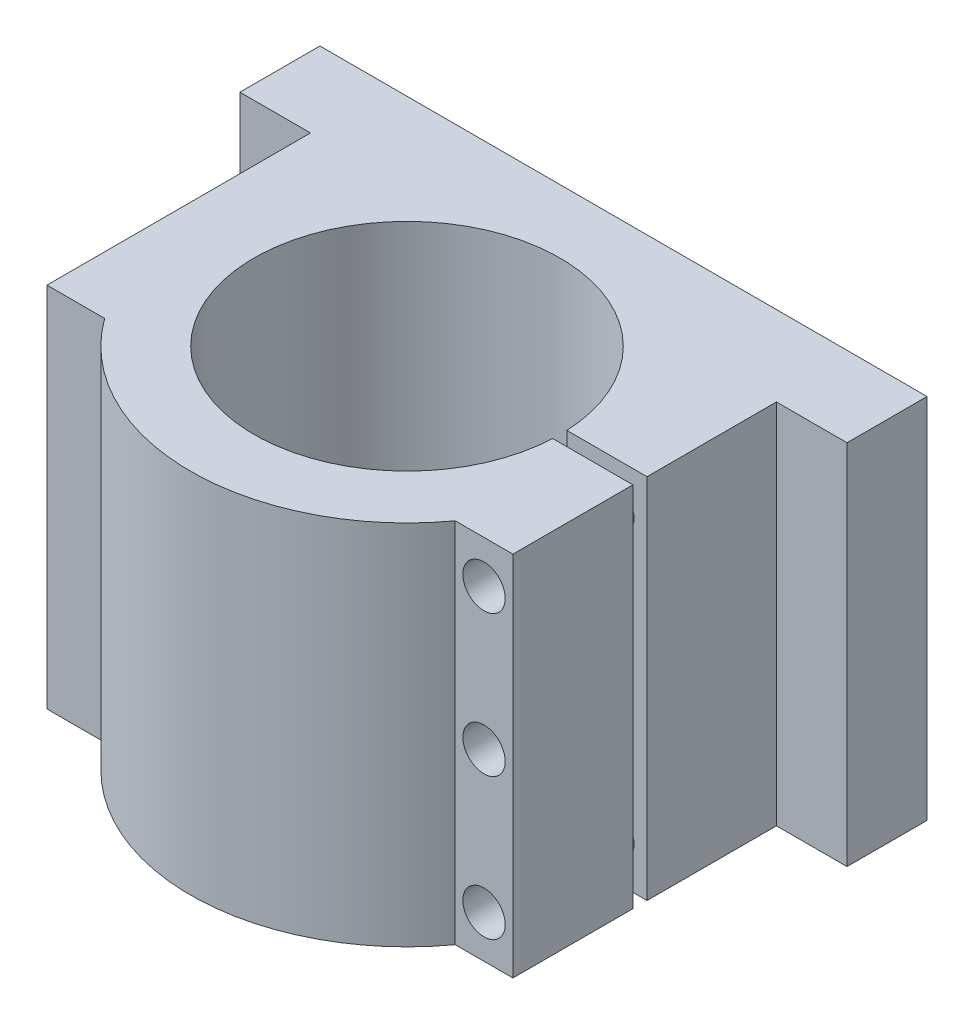
ISO-10303-21;
HEADER;
FILE_DESCRIPTION(('STEP AP214'),'2;1');
FILE_NAME('part.step','',(''),(''),'','','');
FILE_SCHEMA(('AUTOMOTIVE_DESIGN { 1 0 10303 214 1 1 1 1 }'));
ENDSEC;
DATA;
#1=APPLICATION_CONTEXT('core data for automotive mechanical design processes');
#2=APPLICATION_PROTOCOL_DEFINITION('international standard','automotive_design',2000,#1);
#3=PRODUCT_CONTEXT('',#1,'mechanical');
#4=PRODUCT('Part','Part','',(#3));
#5=PRODUCT_RELATED_PRODUCT_CATEGORY('part','',(#4));
#6=PRODUCT_DEFINITION_FORMATION('','',#4);
#7=PRODUCT_DEFINITION_CONTEXT('part definition',#1,'design');
#8=PRODUCT_DEFINITION('design','',#6,#7);
#9=PRODUCT_DEFINITION_SHAPE('','',#8);
#10=(LENGTH_UNIT() NAMED_UNIT(*) SI_UNIT(.MILLI.,.METRE.));
#11=(NAMED_UNIT(*) PLANE_ANGLE_UNIT() SI_UNIT($,.RADIAN.));
#12=(NAMED_UNIT(*) SI_UNIT($,.STERADIAN.) SOLID_ANGLE_UNIT());
#13=UNCERTAINTY_MEASURE_WITH_UNIT(LENGTH_MEASURE(1.E-05),#10,'distance_accuracy_value','');
#14=(GEOMETRIC_REPRESENTATION_CONTEXT(3) GLOBAL_UNCERTAINTY_ASSIGNED_CONTEXT((#13)) GLOBAL_UNIT_ASSIGNED_CONTEXT((#10,
#11,#12)) REPRESENTATION_CONTEXT('',''));
#15=CARTESIAN_POINT('',(0.,0.,0.));
#16=DIRECTION('',(0.,0.,1.));
#17=DIRECTION('',(1.,0.,0.));
#18=AXIS2_PLACEMENT_3D('',#15,#16,#17);
#19=CARTESIAN_POINT('',(37.2424488990722,78.,73.));
#20=DIRECTION('',(0.,0.,-1.));
#21=DIRECTION('',(-1.,0.,0.));
#22=AXIS2_PLACEMENT_3D('',#19,#20,#21);
#23=PLANE('',#22);
#24=DIRECTION('',(1.,0.,0.));
#25=VECTOR('',#24,1.);
#26=CARTESIAN_POINT('',(37.2424488990722,0.,73.));
#27=LINE('',#26,#25);
#28=CARTESIAN_POINT('',(37.2424488990722,0.,73.));
#29=VERTEX_POINT('',#28);
#30=CARTESIAN_POINT('',(49.5,0.,73.));
#31=VERTEX_POINT('',#30);
#32=EDGE_CURVE('E192',#29,#31,#27,.T.);
#33=ORIENTED_EDGE('',*,*,#32,.T.);
#34=DIRECTION('',(0.,-1.,0.));
#35=VECTOR('',#34,1.);
#36=CARTESIAN_POINT('',(49.5,78.,73.));
#37=LINE('',#36,#35);
#38=CARTESIAN_POINT('',(49.5,78.,73.));
#39=VERTEX_POINT('',#38);
#40=EDGE_CURVE('E219',#39,#31,#37,.T.);
#41=ORIENTED_EDGE('',*,*,#40,.F.);
#42=DIRECTION('',(1.,0.,0.));
#43=VECTOR('',#42,1.);
#44=CARTESIAN_POINT('',(37.2424488990722,78.,73.));
#45=LINE('',#44,#43);
#46=CARTESIAN_POINT('',(37.2424488990722,78.,73.));
#47=VERTEX_POINT('',#46);
#48=EDGE_CURVE('E260',#47,#39,#45,.T.);
#49=ORIENTED_EDGE('',*,*,#48,.F.);
#50=DIRECTION('',(0.,-1.,0.));
#51=VECTOR('',#50,1.);
#52=CARTESIAN_POINT('',(37.2424488990722,78.,73.));
#53=LINE('',#52,#51);
#54=EDGE_CURVE('E222',#47,#29,#53,.T.);
#55=ORIENTED_EDGE('',*,*,#54,.T.);
#56=EDGE_LOOP('',(#33,#41,#49,#55));
#57=FACE_BOUND('',#56,.T.);
#58=CARTESIAN_POINT('',(43.3712244495361,9.00000000000001,73.));
#59=DIRECTION('',(0.,0.,1.));
#60=DIRECTION('',(1.,0.,0.));
#61=AXIS2_PLACEMENT_3D('',#58,#59,#60);
#62=CIRCLE('',#61,4.49999999999999);
#63=CARTESIAN_POINT('',(47.8712244495361,9.00000000000001,73.));
#64=VERTEX_POINT('',#63);
#65=EDGE_CURVE('E288',#64,#64,#62,.T.);
#66=ORIENTED_EDGE('',*,*,#65,.F.);
#67=EDGE_LOOP('',(#66));
#68=FACE_BOUND('',#67,.T.);
#69=CARTESIAN_POINT('',(43.3712244495361,39.,73.));
#70=DIRECTION('',(0.,0.,1.));
#71=DIRECTION('',(1.,0.,0.));
#72=AXIS2_PLACEMENT_3D('',#69,#70,#71);
#73=CIRCLE('',#72,4.49999999999999);
#74=CARTESIAN_POINT('',(47.8712244495361,39.,73.));
#75=VERTEX_POINT('',#74);
#76=EDGE_CURVE('E294',#75,#75,#73,.T.);
#77=ORIENTED_EDGE('',*,*,#76,.F.);
#78=EDGE_LOOP('',(#77));
#79=FACE_BOUND('',#78,.T.);
#80=CARTESIAN_POINT('',(43.3712244495361,69.,73.));
#81=DIRECTION('',(0.,0.,1.));
#82=DIRECTION('',(1.,0.,0.));
#83=AXIS2_PLACEMENT_3D('',#80,#81,#82);
#84=CIRCLE('',#83,4.49999999999999);
#85=CARTESIAN_POINT('',(47.8712244495361,69.,73.));
#86=VERTEX_POINT('',#85);
#87=EDGE_CURVE('E300',#86,#86,#84,.T.);
#88=ORIENTED_EDGE('',*,*,#87,.F.);
#89=EDGE_LOOP('',(#88));
#90=FACE_BOUND('',#89,.T.);
#91=ADVANCED_FACE('F41',(#57,#68,#79,#90),#23,.F.);
#92=CARTESIAN_POINT('',(-64.5,78.,0.));
#93=DIRECTION('',(1.,0.,0.));
#94=DIRECTION('',(0.,0.,-1.));
#95=AXIS2_PLACEMENT_3D('',#92,#93,#94);
#96=PLANE('',#95);
#97=DIRECTION('',(0.,0.,1.));
#98=VECTOR('',#97,1.);
#99=CARTESIAN_POINT('',(-64.5,0.,0.));
#100=LINE('',#99,#98);
#101=CARTESIAN_POINT('',(-64.5,0.,0.));
#102=VERTEX_POINT('',#101);
#103=CARTESIAN_POINT('',(-64.5,0.,17.));
#104=VERTEX_POINT('',#103);
#105=EDGE_CURVE('E181',#102,#104,#100,.T.);
#106=ORIENTED_EDGE('',*,*,#105,.T.);
#107=DIRECTION('',(0.,-1.,0.));
#108=VECTOR('',#107,1.);
#109=CARTESIAN_POINT('',(-64.5,78.,17.));
#110=LINE('',#109,#108);
#111=CARTESIAN_POINT('',(-64.5,78.,17.));
#112=VERTEX_POINT('',#111);
#113=EDGE_CURVE('E50',#112,#104,#110,.T.);
#114=ORIENTED_EDGE('',*,*,#113,.F.);
#115=DIRECTION('',(0.,0.,1.));
#116=VECTOR('',#115,1.);
#117=CARTESIAN_POINT('',(-64.5,78.,0.));
#118=LINE('',#117,#116);
#119=CARTESIAN_POINT('',(-64.5,78.,0.));
#120=VERTEX_POINT('',#119);
#121=EDGE_CURVE('E121',#120,#112,#118,.T.);
#122=ORIENTED_EDGE('',*,*,#121,.F.);
#123=DIRECTION('',(0.,-1.,0.));
#124=VECTOR('',#123,1.);
#125=CARTESIAN_POINT('',(-64.5,78.,0.));
#126=LINE('',#125,#124);
#127=EDGE_CURVE('E11',#120,#102,#126,.T.);
#128=ORIENTED_EDGE('',*,*,#127,.T.);
#129=EDGE_LOOP('',(#106,#114,#122,#128));
#130=FACE_BOUND('',#129,.T.);
#131=ADVANCED_FACE('F43',(#130),#96,.F.);
#132=CARTESIAN_POINT('',(-64.5,78.,17.));
#133=DIRECTION('',(0.,0.,-1.));
#134=DIRECTION('',(-1.,0.,0.));
#135=AXIS2_PLACEMENT_3D('',#132,#133,#134);
#136=PLANE('',#135);
#137=DIRECTION('',(1.,0.,0.));
#138=VECTOR('',#137,1.);
#139=CARTESIAN_POINT('',(-64.5,0.,17.));
#140=LINE('',#139,#138);
#141=CARTESIAN_POINT('',(-49.5,0.,17.));
#142=VERTEX_POINT('',#141);
#143=EDGE_CURVE('E183',#104,#142,#140,.T.);
#144=ORIENTED_EDGE('',*,*,#143,.T.);
#145=DIRECTION('',(0.,-1.,0.));
#146=VECTOR('',#145,1.);
#147=CARTESIAN_POINT('',(-49.5,78.,17.));
#148=LINE('',#147,#146);
#149=CARTESIAN_POINT('',(-49.5,78.,17.));
#150=VERTEX_POINT('',#149);
#151=EDGE_CURVE('E231',#150,#142,#148,.T.);
#152=ORIENTED_EDGE('',*,*,#151,.F.);
#153=DIRECTION('',(1.,0.,0.));
#154=VECTOR('',#153,1.);
#155=CARTESIAN_POINT('',(-64.5,78.,17.));
#156=LINE('',#155,#154);
#157=EDGE_CURVE('E239',#112,#150,#156,.T.);
#158=ORIENTED_EDGE('',*,*,#157,.F.);
#159=ORIENTED_EDGE('',*,*,#113,.T.);
#160=EDGE_LOOP('',(#144,#152,#158,#159));
#161=FACE_BOUND('',#160,.T.);
#162=ADVANCED_FACE('F237',(#161),#136,.F.);
#163=CARTESIAN_POINT('',(-49.5,78.,17.));
#164=DIRECTION('',(1.,0.,0.));
#165=DIRECTION('',(0.,0.,-1.));
#166=AXIS2_PLACEMENT_3D('',#163,#164,#165);
#167=PLANE('',#166);
#168=DIRECTION('',(0.,0.,1.));
#169=VECTOR('',#168,1.);
#170=CARTESIAN_POINT('',(-49.5,0.,17.));
#171=LINE('',#170,#169);
#172=CARTESIAN_POINT('',(-49.5,0.,73.));
#173=VERTEX_POINT('',#172);
#174=EDGE_CURVE('E186',#142,#173,#171,.T.);
#175=ORIENTED_EDGE('',*,*,#174,.T.);
#176=DIRECTION('',(0.,-1.,0.));
#177=VECTOR('',#176,1.);
#178=CARTESIAN_POINT('',(-49.5,78.,73.));
#179=LINE('',#178,#177);
#180=CARTESIAN_POINT('',(-49.5,78.,73.));
#181=VERTEX_POINT('',#180);
#182=EDGE_CURVE('E228',#181,#173,#179,.T.);
#183=ORIENTED_EDGE('',*,*,#182,.F.);
#184=DIRECTION('',(0.,0.,1.));
#185=VECTOR('',#184,1.);
#186=CARTESIAN_POINT('',(-49.5,78.,17.));
#187=LINE('',#186,#185);
#188=EDGE_CURVE('E258',#150,#181,#187,.T.);
#189=ORIENTED_EDGE('',*,*,#188,.F.);
#190=ORIENTED_EDGE('',*,*,#151,.T.);
#191=EDGE_LOOP('',(#175,#183,#189,#190));
#192=FACE_BOUND('',#191,.T.);
#193=ADVANCED_FACE('F249',(#192),#167,.F.);
#194=CARTESIAN_POINT('',(-49.5,78.,73.));
#195=DIRECTION('',(0.,0.,-1.));
#196=DIRECTION('',(-1.,0.,0.));
#197=AXIS2_PLACEMENT_3D('',#194,#195,#196);
#198=PLANE('',#197);
#199=DIRECTION('',(1.,0.,0.));
#200=VECTOR('',#199,1.);
#201=CARTESIAN_POINT('',(-49.5,0.,73.));
#202=LINE('',#201,#200);
#203=CARTESIAN_POINT('',(-37.2424488990722,0.,73.));
#204=VERTEX_POINT('',#203);
#205=EDGE_CURVE('E188',#173,#204,#202,.T.);
#206=ORIENTED_EDGE('',*,*,#205,.T.);
#207=DIRECTION('',(0.,-1.,0.));
#208=VECTOR('',#207,1.);
#209=CARTESIAN_POINT('',(-37.2424488990722,78.,73.));
#210=LINE('',#209,#208);
#211=CARTESIAN_POINT('',(-37.2424488990722,78.,73.));
#212=VERTEX_POINT('',#211);
#213=EDGE_CURVE('E225',#212,#204,#210,.T.);
#214=ORIENTED_EDGE('',*,*,#213,.F.);
#215=DIRECTION('',(1.,0.,0.));
#216=VECTOR('',#215,1.);
#217=CARTESIAN_POINT('',(-49.5,78.,73.));
#218=LINE('',#217,#216);
#219=EDGE_CURVE('E255',#181,#212,#218,.T.);
#220=ORIENTED_EDGE('',*,*,#219,.F.);
#221=ORIENTED_EDGE('',*,*,#182,.T.);
#222=EDGE_LOOP('',(#206,#214,#220,#221));
#223=FACE_BOUND('',#222,.T.);
#224=ADVANCED_FACE('F253',(#223),#198,.F.);
#225=CARTESIAN_POINT('',(0.,78.,46.));
#226=DIRECTION('',(0.,-1.,0.));
#227=DIRECTION('',(0.,0.,-1.));
#228=AXIS2_PLACEMENT_3D('',#225,#226,#227);
#229=CYLINDRICAL_SURFACE('',#228,46.);
#230=CARTESIAN_POINT('',(0.,0.,46.));
#231=DIRECTION('',(0.,1.,0.));
#232=DIRECTION('',(0.,0.,1.));
#233=AXIS2_PLACEMENT_3D('',#230,#231,#232);
#234=CIRCLE('',#233,46.);
#235=EDGE_CURVE('E190',#204,#29,#234,.T.);
#236=ORIENTED_EDGE('',*,*,#235,.T.);
#237=ORIENTED_EDGE('',*,*,#54,.F.);
#238=CARTESIAN_POINT('',(0.,78.,46.));
#239=DIRECTION('',(0.,1.,0.));
#240=DIRECTION('',(0.,0.,1.));
#241=AXIS2_PLACEMENT_3D('',#238,#239,#240);
#242=CIRCLE('',#241,46.);
#243=EDGE_CURVE('E257',#212,#47,#242,.T.);
#244=ORIENTED_EDGE('',*,*,#243,.F.);
#245=ORIENTED_EDGE('',*,*,#213,.T.);
#246=EDGE_LOOP('',(#236,#237,#244,#245));
#247=FACE_BOUND('',#246,.T.);
#248=ADVANCED_FACE('F350',(#247),#229,.T.);
#249=CARTESIAN_POINT('',(49.5,78.,73.));
#250=DIRECTION('',(-1.,0.,0.));
#251=DIRECTION('',(0.,0.,1.));
#252=AXIS2_PLACEMENT_3D('',#249,#250,#251);
#253=PLANE('',#252);
#254=DIRECTION('',(0.,0.,-1.));
#255=VECTOR('',#254,1.);
#256=CARTESIAN_POINT('',(49.5,0.,73.));
#257=LINE('',#256,#255);
#258=CARTESIAN_POINT('',(49.5,0.,47.5));
#259=VERTEX_POINT('',#258);
#260=EDGE_CURVE('E194',#31,#259,#257,.T.);
#261=ORIENTED_EDGE('',*,*,#260,.T.);
#262=DIRECTION('',(0.,-1.,0.));
#263=VECTOR('',#262,1.);
#264=CARTESIAN_POINT('',(49.5,78.,47.5));
#265=LINE('',#264,#263);
#266=CARTESIAN_POINT('',(49.5,78.,47.5));
#267=VERTEX_POINT('',#266);
#268=EDGE_CURVE('E216',#267,#259,#265,.T.);
#269=ORIENTED_EDGE('',*,*,#268,.F.);
#270=DIRECTION('',(0.,0.,-1.));
#271=VECTOR('',#270,1.);
#272=CARTESIAN_POINT('',(49.5,78.,73.));
#273=LINE('',#272,#271);
#274=EDGE_CURVE('E266',#39,#267,#273,.T.);
#275=ORIENTED_EDGE('',*,*,#274,.F.);
#276=ORIENTED_EDGE('',*,*,#40,.T.);
#277=EDGE_LOOP('',(#261,#269,#275,#276));
#278=FACE_BOUND('',#277,.T.);
#279=ADVANCED_FACE('F348',(#278),#253,.F.);
#280=CARTESIAN_POINT('',(49.5,78.,47.5));
#281=DIRECTION('',(0.,0.,1.));
#282=DIRECTION('',(1.,0.,0.));
#283=AXIS2_PLACEMENT_3D('',#280,#281,#282);
#284=PLANE('',#283);
#285=CARTESIAN_POINT('',(43.3712244495361,69.,47.5));
#286=DIRECTION('',(0.,0.,1.));
#287=DIRECTION('',(1.,0.,0.));
#288=AXIS2_PLACEMENT_3D('',#285,#286,#287);
#289=CIRCLE('',#288,4.49999999999999);
#290=CARTESIAN_POINT('',(47.8712244495361,69.,47.5));
#291=VERTEX_POINT('',#290);
#292=EDGE_CURVE('E297',#291,#291,#289,.T.);
#293=ORIENTED_EDGE('',*,*,#292,.T.);
#294=EDGE_LOOP('',(#293));
#295=FACE_BOUND('',#294,.T.);
#296=CARTESIAN_POINT('',(43.3712244495361,39.,47.5));
#297=DIRECTION('',(0.,0.,1.));
#298=DIRECTION('',(1.,0.,0.));
#299=AXIS2_PLACEMENT_3D('',#296,#297,#298);
#300=CIRCLE('',#299,4.49999999999999);
#301=CARTESIAN_POINT('',(47.8712244495361,39.,47.5));
#302=VERTEX_POINT('',#301);
#303=EDGE_CURVE('E291',#302,#302,#300,.T.);
#304=ORIENTED_EDGE('',*,*,#303,.T.);
#305=EDGE_LOOP('',(#304));
#306=FACE_BOUND('',#305,.T.);
#307=CARTESIAN_POINT('',(43.3712244495361,9.00000000000001,47.5));
#308=DIRECTION('',(0.,0.,1.));
#309=DIRECTION('',(1.,0.,0.));
#310=AXIS2_PLACEMENT_3D('',#307,#308,#309);
#311=CIRCLE('',#310,4.49999999999999);
#312=CARTESIAN_POINT('',(47.8712244495361,9.00000000000001,47.5));
#313=VERTEX_POINT('',#312);
#314=EDGE_CURVE('E184',#313,#313,#311,.T.);
#315=ORIENTED_EDGE('',*,*,#314,.T.);
#316=EDGE_LOOP('',(#315));
#317=FACE_BOUND('',#316,.T.);
#318=DIRECTION('',(-1.,0.,0.));
#319=VECTOR('',#318,1.);
#320=CARTESIAN_POINT('',(49.5,0.,47.5));
#321=LINE('',#320,#319);
#322=CARTESIAN_POINT('',(32.4653661614959,0.,47.5));
#323=VERTEX_POINT('',#322);
#324=EDGE_CURVE('E196',#259,#323,#321,.T.);
#325=ORIENTED_EDGE('',*,*,#324,.T.);
#326=DIRECTION('',(0.,-1.,0.));
#327=VECTOR('',#326,1.);
#328=CARTESIAN_POINT('',(32.4653661614959,78.,47.5));
#329=LINE('',#328,#327);
#330=CARTESIAN_POINT('',(32.4653661614959,78.,47.5));
#331=VERTEX_POINT('',#330);
#332=EDGE_CURVE('E213',#331,#323,#329,.T.);
#333=ORIENTED_EDGE('',*,*,#332,.F.);
#334=DIRECTION('',(-1.,0.,0.));
#335=VECTOR('',#334,1.);
#336=CARTESIAN_POINT('',(49.5,78.,47.5));
#337=LINE('',#336,#335);
#338=EDGE_CURVE('E268',#267,#331,#337,.T.);
#339=ORIENTED_EDGE('',*,*,#338,.F.);
#340=ORIENTED_EDGE('',*,*,#268,.T.);
#341=EDGE_LOOP('',(#325,#333,#339,#340));
#342=FACE_BOUND('',#341,.T.);
#343=ADVANCED_FACE('F380',(#295,#306,#317,#342),#284,.F.);
#344=CARTESIAN_POINT('',(0.,78.,46.));
#345=DIRECTION('',(0.,-1.,0.));
#346=DIRECTION('',(0.,0.,-1.));
#347=AXIS2_PLACEMENT_3D('',#344,#345,#346);
#348=CYLINDRICAL_SURFACE('',#347,32.5);
#349=CARTESIAN_POINT('',(0.,0.,46.));
#350=DIRECTION('',(0.,-1.,0.));
#351=DIRECTION('',(0.,0.,1.));
#352=AXIS2_PLACEMENT_3D('',#349,#350,#351);
#353=CIRCLE('',#352,32.5);
#354=CARTESIAN_POINT('',(32.4653661614959,0.,44.5));
#355=VERTEX_POINT('',#354);
#356=EDGE_CURVE('E198',#323,#355,#353,.T.);
#357=ORIENTED_EDGE('',*,*,#356,.T.);
#358=DIRECTION('',(0.,-1.,0.));
#359=VECTOR('',#358,1.);
#360=CARTESIAN_POINT('',(32.4653661614959,78.,44.5));
#361=LINE('',#360,#359);
#362=CARTESIAN_POINT('',(32.4653661614959,78.,44.5));
#363=VERTEX_POINT('',#362);
#364=EDGE_CURVE('E210',#363,#355,#361,.T.);
#365=ORIENTED_EDGE('',*,*,#364,.F.);
#366=CARTESIAN_POINT('',(0.,78.,46.));
#367=DIRECTION('',(0.,-1.,0.));
#368=DIRECTION('',(0.,0.,1.));
#369=AXIS2_PLACEMENT_3D('',#366,#367,#368);
#370=CIRCLE('',#369,32.5);
#371=EDGE_CURVE('E270',#331,#363,#370,.T.);
#372=ORIENTED_EDGE('',*,*,#371,.F.);
#373=ORIENTED_EDGE('',*,*,#332,.T.);
#374=EDGE_LOOP('',(#357,#365,#372,#373));
#375=FACE_BOUND('',#374,.T.);
#376=ADVANCED_FACE('F276',(#375),#348,.F.);
#377=CARTESIAN_POINT('',(49.5,78.,44.5));
#378=DIRECTION('',(0.,0.,-1.));
#379=DIRECTION('',(-1.,0.,0.));
#380=AXIS2_PLACEMENT_3D('',#377,#378,#379);
#381=PLANE('',#380);
#382=CARTESIAN_POINT('',(43.3712244495361,69.,44.5));
#383=DIRECTION('',(0.,0.,1.));
#384=DIRECTION('',(1.,0.,0.));
#385=AXIS2_PLACEMENT_3D('',#382,#383,#384);
#386=CIRCLE('',#385,3.39999999999999);
#387=CARTESIAN_POINT('',(46.7712244495361,69.,44.5));
#388=VERTEX_POINT('',#387);
#389=EDGE_CURVE('E312',#388,#388,#386,.T.);
#390=ORIENTED_EDGE('',*,*,#389,.F.);
#391=EDGE_LOOP('',(#390));
#392=FACE_BOUND('',#391,.T.);
#393=CARTESIAN_POINT('',(43.3712244495361,9.00000000000001,44.5));
#394=DIRECTION('',(0.,0.,1.));
#395=DIRECTION('',(1.,0.,0.));
#396=AXIS2_PLACEMENT_3D('',#393,#394,#395);
#397=CIRCLE('',#396,3.39999999999999);
#398=CARTESIAN_POINT('',(46.7712244495361,9.00000000000001,44.5));
#399=VERTEX_POINT('',#398);
#400=EDGE_CURVE('E306',#399,#399,#397,.T.);
#401=ORIENTED_EDGE('',*,*,#400,.F.);
#402=EDGE_LOOP('',(#401));
#403=FACE_BOUND('',#402,.T.);
#404=DIRECTION('',(1.,0.,0.));
#405=VECTOR('',#404,1.);
#406=CARTESIAN_POINT('',(49.5,0.,44.5));
#407=LINE('',#406,#405);
#408=CARTESIAN_POINT('',(49.5,0.,44.5));
#409=VERTEX_POINT('',#408);
#410=EDGE_CURVE('E200',#355,#409,#407,.T.);
#411=ORIENTED_EDGE('',*,*,#410,.T.);
#412=DIRECTION('',(0.,-1.,0.));
#413=VECTOR('',#412,1.);
#414=CARTESIAN_POINT('',(49.5,78.,44.5));
#415=LINE('',#414,#413);
#416=CARTESIAN_POINT('',(49.5,78.,44.5));
#417=VERTEX_POINT('',#416);
#418=EDGE_CURVE('E170',#417,#409,#415,.T.);
#419=ORIENTED_EDGE('',*,*,#418,.F.);
#420=DIRECTION('',(1.,0.,0.));
#421=VECTOR('',#420,1.);
#422=CARTESIAN_POINT('',(49.5,78.,44.5));
#423=LINE('',#422,#421);
#424=EDGE_CURVE('E161',#363,#417,#423,.T.);
#425=ORIENTED_EDGE('',*,*,#424,.F.);
#426=ORIENTED_EDGE('',*,*,#364,.T.);
#427=EDGE_LOOP('',(#411,#419,#425,#426));
#428=FACE_BOUND('',#427,.T.);
#429=ADVANCED_FACE('F280',(#392,#403,#428),#381,.F.);
#430=CARTESIAN_POINT('',(49.5,78.,44.5));
#431=DIRECTION('',(-1.,0.,0.));
#432=DIRECTION('',(0.,0.,1.));
#433=AXIS2_PLACEMENT_3D('',#430,#431,#432);
#434=PLANE('',#433);
#435=DIRECTION('',(0.,0.,-1.));
#436=VECTOR('',#435,1.);
#437=CARTESIAN_POINT('',(49.5,0.,44.5));
#438=LINE('',#437,#436);
#439=CARTESIAN_POINT('',(49.5,0.,17.));
#440=VERTEX_POINT('',#439);
#441=EDGE_CURVE('E169',#409,#440,#438,.T.);
#442=ORIENTED_EDGE('',*,*,#441,.T.);
#443=DIRECTION('',(0.,-1.,0.));
#444=VECTOR('',#443,1.);
#445=CARTESIAN_POINT('',(49.5,78.,17.));
#446=LINE('',#445,#444);
#447=CARTESIAN_POINT('',(49.5,78.,17.));
#448=VERTEX_POINT('',#447);
#449=EDGE_CURVE('E166',#448,#440,#446,.T.);
#450=ORIENTED_EDGE('',*,*,#449,.F.);
#451=DIRECTION('',(0.,0.,-1.));
#452=VECTOR('',#451,1.);
#453=CARTESIAN_POINT('',(49.5,78.,44.5));
#454=LINE('',#453,#452);
#455=EDGE_CURVE('E155',#417,#448,#454,.T.);
#456=ORIENTED_EDGE('',*,*,#455,.F.);
#457=ORIENTED_EDGE('',*,*,#418,.T.);
#458=EDGE_LOOP('',(#442,#450,#456,#457));
#459=FACE_BOUND('',#458,.T.);
#460=ADVANCED_FACE('F167',(#459),#434,.F.);
#461=CARTESIAN_POINT('',(49.5,78.,17.));
#462=DIRECTION('',(0.,0.,-1.));
#463=DIRECTION('',(-1.,0.,0.));
#464=AXIS2_PLACEMENT_3D('',#461,#462,#463);
#465=PLANE('',#464);
#466=DIRECTION('',(1.,0.,0.));
#467=VECTOR('',#466,1.);
#468=CARTESIAN_POINT('',(49.5,0.,17.));
#469=LINE('',#468,#467);
#470=CARTESIAN_POINT('',(64.5,0.,17.));
#471=VERTEX_POINT('',#470);
#472=EDGE_CURVE('E107',#440,#471,#469,.T.);
#473=ORIENTED_EDGE('',*,*,#472,.T.);
#474=DIRECTION('',(0.,-1.,0.));
#475=VECTOR('',#474,1.);
#476=CARTESIAN_POINT('',(64.5,78.,17.));
#477=LINE('',#476,#475);
#478=CARTESIAN_POINT('',(64.5,78.,17.));
#479=VERTEX_POINT('',#478);
#480=EDGE_CURVE('E171',#479,#471,#477,.T.);
#481=ORIENTED_EDGE('',*,*,#480,.F.);
#482=DIRECTION('',(1.,0.,0.));
#483=VECTOR('',#482,1.);
#484=CARTESIAN_POINT('',(49.5,78.,17.));
#485=LINE('',#484,#483);
#486=EDGE_CURVE('E159',#448,#479,#485,.T.);
#487=ORIENTED_EDGE('',*,*,#486,.F.);
#488=ORIENTED_EDGE('',*,*,#449,.T.);
#489=EDGE_LOOP('',(#473,#481,#487,#488));
#490=FACE_BOUND('',#489,.T.);
#491=ADVANCED_FACE('F173',(#490),#465,.F.);
#492=CARTESIAN_POINT('',(64.5,78.,17.));
#493=DIRECTION('',(-1.,0.,0.));
#494=DIRECTION('',(0.,0.,1.));
#495=AXIS2_PLACEMENT_3D('',#492,#493,#494);
#496=PLANE('',#495);
#497=DIRECTION('',(0.,0.,-1.));
#498=VECTOR('',#497,1.);
#499=CARTESIAN_POINT('',(64.5,0.,17.));
#500=LINE('',#499,#498);
#501=CARTESIAN_POINT('',(64.5,0.,0.));
#502=VERTEX_POINT('',#501);
#503=EDGE_CURVE('E114',#471,#502,#500,.T.);
#504=ORIENTED_EDGE('',*,*,#503,.T.);
#505=DIRECTION('',(0.,-1.,0.));
#506=VECTOR('',#505,1.);
#507=CARTESIAN_POINT('',(64.5,78.,0.));
#508=LINE('',#507,#506);
#509=CARTESIAN_POINT('',(64.5,78.,0.));
#510=VERTEX_POINT('',#509);
#511=EDGE_CURVE('E177',#510,#502,#508,.T.);
#512=ORIENTED_EDGE('',*,*,#511,.F.);
#513=DIRECTION('',(0.,0.,-1.));
#514=VECTOR('',#513,1.);
#515=CARTESIAN_POINT('',(64.5,78.,17.));
#516=LINE('',#515,#514);
#517=EDGE_CURVE('E175',#479,#510,#516,.T.);
#518=ORIENTED_EDGE('',*,*,#517,.F.);
#519=ORIENTED_EDGE('',*,*,#480,.T.);
#520=EDGE_LOOP('',(#504,#512,#518,#519));
#521=FACE_BOUND('',#520,.T.);
#522=ADVANCED_FACE('F282',(#521),#496,.F.);
#523=CARTESIAN_POINT('',(64.5,78.,0.));
#524=DIRECTION('',(0.,0.,1.));
#525=DIRECTION('',(1.,0.,0.));
#526=AXIS2_PLACEMENT_3D('',#523,#524,#525);
#527=PLANE('',#526);
#528=DIRECTION('',(-1.,0.,0.));
#529=VECTOR('',#528,1.);
#530=CARTESIAN_POINT('',(64.5,0.,0.));
#531=LINE('',#530,#529);
#532=EDGE_CURVE('E205',#502,#102,#531,.T.);
#533=ORIENTED_EDGE('',*,*,#532,.T.);
#534=ORIENTED_EDGE('',*,*,#127,.F.);
#535=DIRECTION('',(-1.,0.,0.));
#536=VECTOR('',#535,1.);
#537=CARTESIAN_POINT('',(-64.5,78.,0.));
#538=LINE('',#537,#536);
#539=EDGE_CURVE('E58',#510,#120,#538,.T.);
#540=ORIENTED_EDGE('',*,*,#539,.F.);
#541=ORIENTED_EDGE('',*,*,#511,.T.);
#542=EDGE_LOOP('',(#533,#534,#540,#541));
#543=FACE_BOUND('',#542,.T.);
#544=ADVANCED_FACE('F281',(#543),#527,.F.);
#545=CARTESIAN_POINT('',(0.,78.,46.));
#546=DIRECTION('',(0.,1.,0.));
#547=DIRECTION('',(0.,0.,1.));
#548=AXIS2_PLACEMENT_3D('',#545,#546,#547);
#549=PLANE('',#548);
#550=ORIENTED_EDGE('',*,*,#539,.T.);
#551=ORIENTED_EDGE('',*,*,#121,.T.);
#552=ORIENTED_EDGE('',*,*,#157,.T.);
#553=ORIENTED_EDGE('',*,*,#188,.T.);
#554=ORIENTED_EDGE('',*,*,#219,.T.);
#555=ORIENTED_EDGE('',*,*,#243,.T.);
#556=ORIENTED_EDGE('',*,*,#48,.T.);
#557=ORIENTED_EDGE('',*,*,#274,.T.);
#558=ORIENTED_EDGE('',*,*,#338,.T.);
#559=ORIENTED_EDGE('',*,*,#371,.T.);
#560=ORIENTED_EDGE('',*,*,#424,.T.);
#561=ORIENTED_EDGE('',*,*,#455,.T.);
#562=ORIENTED_EDGE('',*,*,#486,.T.);
#563=ORIENTED_EDGE('',*,*,#517,.T.);
#564=EDGE_LOOP('',(#550,#551,#552,#553,#554,#555,#556,#557,#558,#559,#560,#561,#562,#563));
#565=FACE_BOUND('',#564,.T.);
#566=ADVANCED_FACE('F157',(#565),#549,.T.);
#567=CARTESIAN_POINT('',(0.,0.,46.));
#568=DIRECTION('',(0.,1.,0.));
#569=DIRECTION('',(0.,0.,1.));
#570=AXIS2_PLACEMENT_3D('',#567,#568,#569);
#571=PLANE('',#570);
#572=ORIENTED_EDGE('',*,*,#105,.F.);
#573=ORIENTED_EDGE('',*,*,#532,.F.);
#574=ORIENTED_EDGE('',*,*,#503,.F.);
#575=ORIENTED_EDGE('',*,*,#472,.F.);
#576=ORIENTED_EDGE('',*,*,#441,.F.);
#577=ORIENTED_EDGE('',*,*,#410,.F.);
#578=ORIENTED_EDGE('',*,*,#356,.F.);
#579=ORIENTED_EDGE('',*,*,#324,.F.);
#580=ORIENTED_EDGE('',*,*,#260,.F.);
#581=ORIENTED_EDGE('',*,*,#32,.F.);
#582=ORIENTED_EDGE('',*,*,#235,.F.);
#583=ORIENTED_EDGE('',*,*,#205,.F.);
#584=ORIENTED_EDGE('',*,*,#174,.F.);
#585=ORIENTED_EDGE('',*,*,#143,.F.);
#586=EDGE_LOOP('',(#572,#573,#574,#575,#576,#577,#578,#579,#580,#581,#582,#583,#584,#585));
#587=FACE_BOUND('',#586,.T.);
#588=ADVANCED_FACE('F243',(#587),#571,.F.);
#589=CARTESIAN_POINT('',(43.3712244495361,9.00000000000001,73.));
#590=DIRECTION('',(0.,0.,1.));
#591=DIRECTION('',(1.,0.,0.));
#592=AXIS2_PLACEMENT_3D('',#589,#590,#591);
#593=CYLINDRICAL_SURFACE('',#592,4.49999999999999);
#594=ORIENTED_EDGE('',*,*,#314,.F.);
#595=EDGE_LOOP('',(#594));
#596=FACE_BOUND('',#595,.T.);
#597=ORIENTED_EDGE('',*,*,#65,.T.);
#598=EDGE_LOOP('',(#597));
#599=FACE_BOUND('',#598,.T.);
#600=ADVANCED_FACE('F434',(#596,#599),#593,.F.);
#601=CARTESIAN_POINT('',(43.3712244495361,39.,73.));
#602=DIRECTION('',(0.,0.,1.));
#603=DIRECTION('',(1.,0.,0.));
#604=AXIS2_PLACEMENT_3D('',#601,#602,#603);
#605=CYLINDRICAL_SURFACE('',#604,4.49999999999999);
#606=ORIENTED_EDGE('',*,*,#303,.F.);
#607=EDGE_LOOP('',(#606));
#608=FACE_BOUND('',#607,.T.);
#609=ORIENTED_EDGE('',*,*,#76,.T.);
#610=EDGE_LOOP('',(#609));
#611=FACE_BOUND('',#610,.T.);
#612=ADVANCED_FACE('F440',(#608,#611),#605,.F.);
#613=CARTESIAN_POINT('',(43.3712244495361,69.,73.));
#614=DIRECTION('',(0.,0.,1.));
#615=DIRECTION('',(1.,0.,0.));
#616=AXIS2_PLACEMENT_3D('',#613,#614,#615);
#617=CYLINDRICAL_SURFACE('',#616,4.49999999999999);
#618=ORIENTED_EDGE('',*,*,#292,.F.);
#619=EDGE_LOOP('',(#618));
#620=FACE_BOUND('',#619,.T.);
#621=ORIENTED_EDGE('',*,*,#87,.T.);
#622=EDGE_LOOP('',(#621));
#623=FACE_BOUND('',#622,.T.);
#624=ADVANCED_FACE('F335',(#620,#623),#617,.F.);
#625=CARTESIAN_POINT('',(43.3712244495361,9.00000000000001,24.75));
#626=DIRECTION('',(0.,0.,1.));
#627=DIRECTION('',(1.,0.,0.));
#628=AXIS2_PLACEMENT_3D('',#625,#626,#627);
#629=CONICAL_SURFACE('',#628,3.39999999999999,1.02974425867665);
#630=CARTESIAN_POINT('',(43.3712244495361,9.00000000000001,22.7070738953063));
#631=VERTEX_POINT('',#630);
#632=VERTEX_LOOP('',#631);
#633=FACE_BOUND('',#632,.T.);
#634=CARTESIAN_POINT('',(43.3712244495361,9.00000000000001,24.75));
#635=DIRECTION('',(0.,0.,1.));
#636=DIRECTION('',(1.,0.,0.));
#637=AXIS2_PLACEMENT_3D('',#634,#635,#636);
#638=CIRCLE('',#637,3.39999999999999);
#639=CARTESIAN_POINT('',(46.7712244495361,9.00000000000001,24.75));
#640=VERTEX_POINT('',#639);
#641=EDGE_CURVE('E303',#640,#640,#638,.T.);
#642=ORIENTED_EDGE('',*,*,#641,.T.);
#643=EDGE_LOOP('',(#642));
#644=FACE_BOUND('',#643,.T.);
#645=ADVANCED_FACE('F326',(#633,#644),#629,.F.);
#646=CARTESIAN_POINT('',(43.3712244495361,9.00000000000001,44.5));
#647=DIRECTION('',(0.,0.,1.));
#648=DIRECTION('',(1.,0.,0.));
#649=AXIS2_PLACEMENT_3D('',#646,#647,#648);
#650=CYLINDRICAL_SURFACE('',#649,3.39999999999999);
#651=ORIENTED_EDGE('',*,*,#641,.F.);
#652=EDGE_LOOP('',(#651));
#653=FACE_BOUND('',#652,.T.);
#654=ORIENTED_EDGE('',*,*,#400,.T.);
#655=EDGE_LOOP('',(#654));
#656=FACE_BOUND('',#655,.T.);
#657=ADVANCED_FACE('F323',(#653,#656),#650,.F.);
#658=CARTESIAN_POINT('',(43.3712244495361,69.,24.75));
#659=DIRECTION('',(0.,0.,1.));
#660=DIRECTION('',(1.,0.,0.));
#661=AXIS2_PLACEMENT_3D('',#658,#659,#660);
#662=CONICAL_SURFACE('',#661,3.39999999999999,1.02974425867665);
#663=CARTESIAN_POINT('',(43.3712244495361,69.,22.7070738953063));
#664=VERTEX_POINT('',#663);
#665=VERTEX_LOOP('',#664);
#666=FACE_BOUND('',#665,.T.);
#667=CARTESIAN_POINT('',(43.3712244495361,69.,24.75));
#668=DIRECTION('',(0.,0.,1.));
#669=DIRECTION('',(1.,0.,0.));
#670=AXIS2_PLACEMENT_3D('',#667,#668,#669);
#671=CIRCLE('',#670,3.39999999999999);
#672=CARTESIAN_POINT('',(46.7712244495361,69.,24.75));
#673=VERTEX_POINT('',#672);
#674=EDGE_CURVE('E309',#673,#673,#671,.T.);
#675=ORIENTED_EDGE('',*,*,#674,.T.);
#676=EDGE_LOOP('',(#675));
#677=FACE_BOUND('',#676,.T.);
#678=ADVANCED_FACE('F325',(#666,#677),#662,.F.);
#679=CARTESIAN_POINT('',(43.3712244495361,69.,44.5));
#680=DIRECTION('',(0.,0.,1.));
#681=DIRECTION('',(1.,0.,0.));
#682=AXIS2_PLACEMENT_3D('',#679,#680,#681);
#683=CYLINDRICAL_SURFACE('',#682,3.39999999999999);
#684=ORIENTED_EDGE('',*,*,#674,.F.);
#685=EDGE_LOOP('',(#684));
#686=FACE_BOUND('',#685,.T.);
#687=ORIENTED_EDGE('',*,*,#389,.T.);
#688=EDGE_LOOP('',(#687));
#689=FACE_BOUND('',#688,.T.);
#690=ADVANCED_FACE('F316',(#686,#689),#683,.F.);
#691=CLOSED_SHELL('',(#91,#131,#162,#193,#224,#248,#279,#343,#376,#429,#460,#491,#522,#544,#566,
#588,#600,#612,#624,#645,#657,#678,#690));
#692=MANIFOLD_SOLID_BREP('B2',#691);
#693=ADVANCED_BREP_SHAPE_REPRESENTATION('',(#18,#692),#14);
#694=SHAPE_DEFINITION_REPRESENTATION(#9,#693);
ENDSEC;
END-ISO-10303-21;
